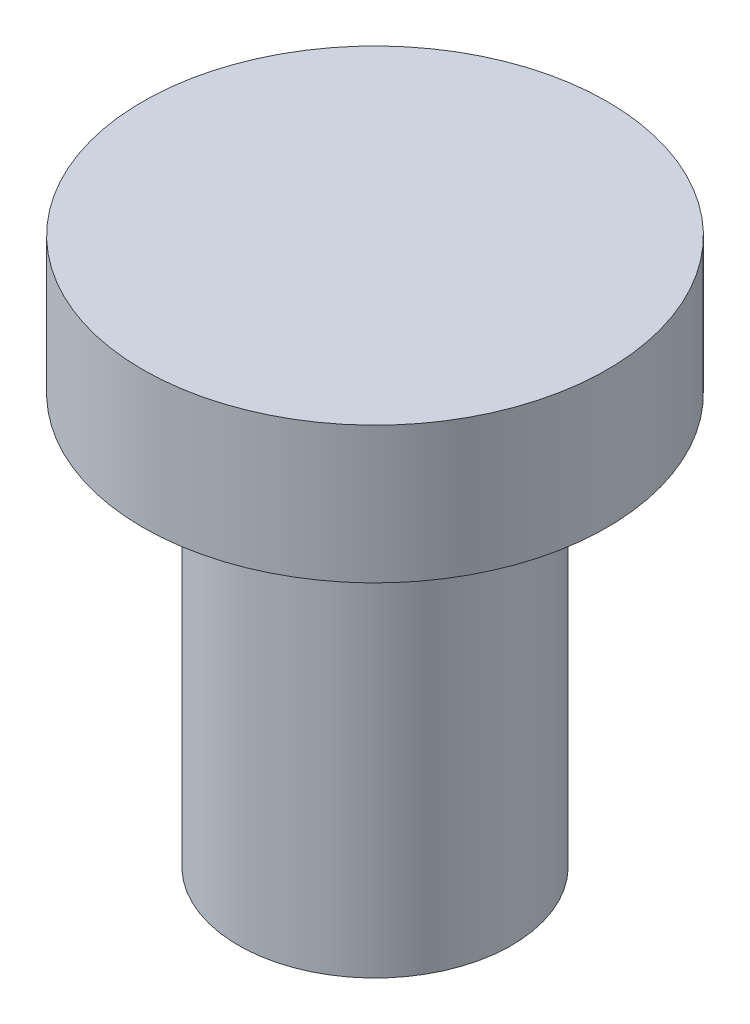
ISO-10303-21;
HEADER;
FILE_DESCRIPTION(('STEP AP214'),'2;1');
FILE_NAME('part.step','',(''),(''),'','','');
FILE_SCHEMA(('AUTOMOTIVE_DESIGN { 1 0 10303 214 1 1 1 1 }'));
ENDSEC;
DATA;
#1=APPLICATION_CONTEXT('core data for automotive mechanical design processes');
#2=APPLICATION_PROTOCOL_DEFINITION('international standard','automotive_design',2000,#1);
#3=PRODUCT_CONTEXT('',#1,'mechanical');
#4=PRODUCT('Part','Part','',(#3));
#5=PRODUCT_RELATED_PRODUCT_CATEGORY('part','',(#4));
#6=PRODUCT_DEFINITION_FORMATION('','',#4);
#7=PRODUCT_DEFINITION_CONTEXT('part definition',#1,'design');
#8=PRODUCT_DEFINITION('design','',#6,#7);
#9=PRODUCT_DEFINITION_SHAPE('','',#8);
#10=(LENGTH_UNIT() NAMED_UNIT(*) SI_UNIT(.MILLI.,.METRE.));
#11=(NAMED_UNIT(*) PLANE_ANGLE_UNIT() SI_UNIT($,.RADIAN.));
#12=(NAMED_UNIT(*) SI_UNIT($,.STERADIAN.) SOLID_ANGLE_UNIT());
#13=UNCERTAINTY_MEASURE_WITH_UNIT(LENGTH_MEASURE(1.E-05),#10,'distance_accuracy_value','');
#14=(GEOMETRIC_REPRESENTATION_CONTEXT(3) GLOBAL_UNCERTAINTY_ASSIGNED_CONTEXT((#13)) GLOBAL_UNIT_ASSIGNED_CONTEXT((#10,
#11,#12)) REPRESENTATION_CONTEXT('',''));
#15=CARTESIAN_POINT('',(0.,0.,0.));
#16=DIRECTION('',(0.,0.,1.));
#17=DIRECTION('',(1.,0.,0.));
#18=AXIS2_PLACEMENT_3D('',#15,#16,#17);
#19=CARTESIAN_POINT('',(0.,1.,0.));
#20=DIRECTION('',(0.,-1.,0.));
#21=DIRECTION('',(0.,0.,-1.));
#22=AXIS2_PLACEMENT_3D('',#19,#20,#21);
#23=CYLINDRICAL_SURFACE('',#22,1.7);
#24=CARTESIAN_POINT('',(0.,1.,0.));
#25=DIRECTION('',(0.,1.,0.));
#26=DIRECTION('',(0.,0.,1.));
#27=AXIS2_PLACEMENT_3D('',#24,#25,#26);
#28=CIRCLE('',#27,1.7);
#29=CARTESIAN_POINT('',(0.,1.,1.7));
#30=VERTEX_POINT('',#29);
#31=EDGE_CURVE('E38',#30,#30,#28,.T.);
#32=ORIENTED_EDGE('',*,*,#31,.F.);
#33=EDGE_LOOP('',(#32));
#34=FACE_BOUND('',#33,.T.);
#35=CARTESIAN_POINT('',(0.,0.,0.));
#36=DIRECTION('',(0.,1.,0.));
#37=DIRECTION('',(0.,0.,1.));
#38=AXIS2_PLACEMENT_3D('',#35,#36,#37);
#39=CIRCLE('',#38,1.7);
#40=CARTESIAN_POINT('',(0.,0.,1.7));
#41=VERTEX_POINT('',#40);
#42=EDGE_CURVE('E34',#41,#41,#39,.T.);
#43=ORIENTED_EDGE('',*,*,#42,.T.);
#44=EDGE_LOOP('',(#43));
#45=FACE_BOUND('',#44,.T.);
#46=ADVANCED_FACE('F31',(#34,#45),#23,.T.);
#47=CARTESIAN_POINT('',(0.,1.,0.));
#48=DIRECTION('',(0.,1.,0.));
#49=DIRECTION('',(0.,0.,1.));
#50=AXIS2_PLACEMENT_3D('',#47,#48,#49);
#51=PLANE('',#50);
#52=ORIENTED_EDGE('',*,*,#31,.T.);
#53=EDGE_LOOP('',(#52));
#54=FACE_BOUND('',#53,.T.);
#55=ADVANCED_FACE('F55',(#54),#51,.T.);
#56=CARTESIAN_POINT('',(0.,0.,0.));
#57=DIRECTION('',(0.,1.,0.));
#58=DIRECTION('',(0.,0.,1.));
#59=AXIS2_PLACEMENT_3D('',#56,#57,#58);
#60=PLANE('',#59);
#61=CARTESIAN_POINT('',(0.,0.,0.));
#62=DIRECTION('',(0.,-1.,0.));
#63=DIRECTION('',(0.,0.,-1.));
#64=AXIS2_PLACEMENT_3D('',#61,#62,#63);
#65=CIRCLE('',#64,1.);
#66=CARTESIAN_POINT('',(0.,0.,-1.));
#67=VERTEX_POINT('',#66);
#68=EDGE_CURVE('E10',#67,#67,#65,.T.);
#69=ORIENTED_EDGE('',*,*,#68,.F.);
#70=EDGE_LOOP('',(#69));
#71=FACE_BOUND('',#70,.T.);
#72=ORIENTED_EDGE('',*,*,#42,.F.);
#73=EDGE_LOOP('',(#72));
#74=FACE_BOUND('',#73,.T.);
#75=ADVANCED_FACE('F52',(#71,#74),#60,.F.);
#76=CARTESIAN_POINT('',(0.,-3.,0.));
#77=DIRECTION('',(0.,1.,0.));
#78=DIRECTION('',(0.,0.,1.));
#79=AXIS2_PLACEMENT_3D('',#76,#77,#78);
#80=CYLINDRICAL_SURFACE('',#79,1.);
#81=CARTESIAN_POINT('',(0.,-3.,0.));
#82=DIRECTION('',(0.,-1.,0.));
#83=DIRECTION('',(0.,0.,-1.));
#84=AXIS2_PLACEMENT_3D('',#81,#82,#83);
#85=CIRCLE('',#84,1.);
#86=CARTESIAN_POINT('',(0.,-3.,-1.));
#87=VERTEX_POINT('',#86);
#88=EDGE_CURVE('E44',#87,#87,#85,.T.);
#89=ORIENTED_EDGE('',*,*,#88,.F.);
#90=EDGE_LOOP('',(#89));
#91=FACE_BOUND('',#90,.T.);
#92=ORIENTED_EDGE('',*,*,#68,.T.);
#93=EDGE_LOOP('',(#92));
#94=FACE_BOUND('',#93,.T.);
#95=ADVANCED_FACE('F54',(#91,#94),#80,.T.);
#96=CARTESIAN_POINT('',(0.,-3.,0.));
#97=DIRECTION('',(0.,-1.,0.));
#98=DIRECTION('',(0.,0.,-1.));
#99=AXIS2_PLACEMENT_3D('',#96,#97,#98);
#100=PLANE('',#99);
#101=ORIENTED_EDGE('',*,*,#88,.T.);
#102=EDGE_LOOP('',(#101));
#103=FACE_BOUND('',#102,.T.);
#104=ADVANCED_FACE('F61',(#103),#100,.T.);
#105=CLOSED_SHELL('',(#46,#55,#75,#95,#104));
#106=MANIFOLD_SOLID_BREP('B2',#105);
#107=ADVANCED_BREP_SHAPE_REPRESENTATION('',(#18,#106),#14);
#108=SHAPE_DEFINITION_REPRESENTATION(#9,#107);
ENDSEC;
END-ISO-10303-21;
